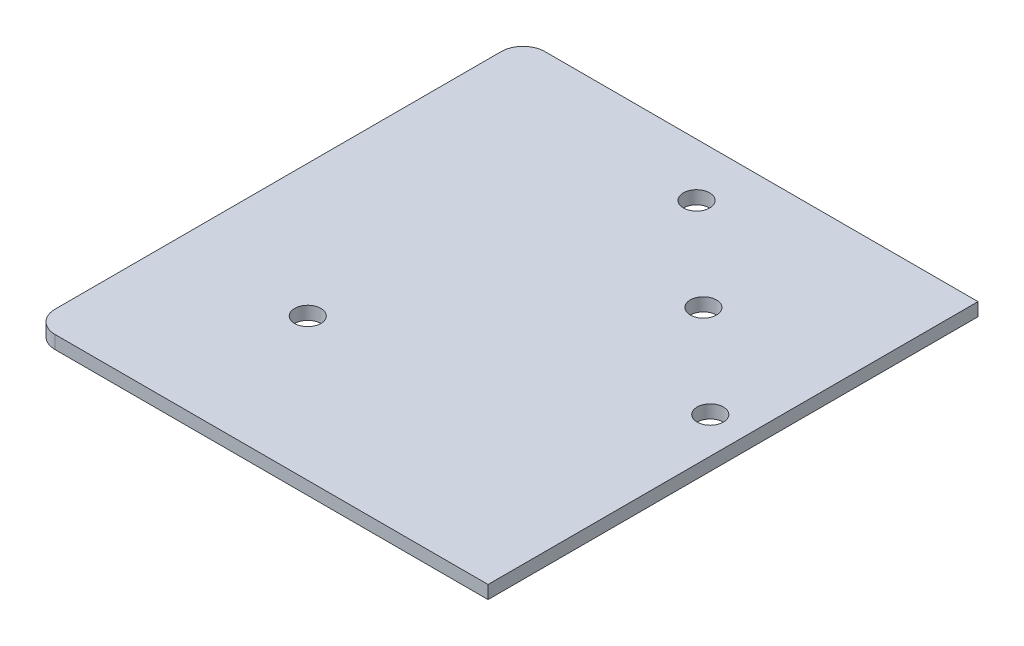
ISO-10303-21;
HEADER;
FILE_DESCRIPTION(('STEP AP214'),'2;1');
FILE_NAME('part.step','',(''),(''),'','','');
FILE_SCHEMA(('AUTOMOTIVE_DESIGN { 1 0 10303 214 1 1 1 1 }'));
ENDSEC;
DATA;
#1=APPLICATION_CONTEXT('core data for automotive mechanical design processes');
#2=APPLICATION_PROTOCOL_DEFINITION('international standard','automotive_design',2000,#1);
#3=PRODUCT_CONTEXT('',#1,'mechanical');
#4=PRODUCT('Part','Part','',(#3));
#5=PRODUCT_RELATED_PRODUCT_CATEGORY('part','',(#4));
#6=PRODUCT_DEFINITION_FORMATION('','',#4);
#7=PRODUCT_DEFINITION_CONTEXT('part definition',#1,'design');
#8=PRODUCT_DEFINITION('design','',#6,#7);
#9=PRODUCT_DEFINITION_SHAPE('','',#8);
#10=(LENGTH_UNIT() NAMED_UNIT(*) SI_UNIT(.MILLI.,.METRE.));
#11=(NAMED_UNIT(*) PLANE_ANGLE_UNIT() SI_UNIT($,.RADIAN.));
#12=(NAMED_UNIT(*) SI_UNIT($,.STERADIAN.) SOLID_ANGLE_UNIT());
#13=UNCERTAINTY_MEASURE_WITH_UNIT(LENGTH_MEASURE(1.E-05),#10,'distance_accuracy_value','');
#14=(GEOMETRIC_REPRESENTATION_CONTEXT(3) GLOBAL_UNCERTAINTY_ASSIGNED_CONTEXT((#13)) GLOBAL_UNIT_ASSIGNED_CONTEXT((#10,
#11,#12)) REPRESENTATION_CONTEXT('',''));
#15=CARTESIAN_POINT('',(0.,0.,0.));
#16=DIRECTION('',(0.,0.,1.));
#17=DIRECTION('',(1.,0.,0.));
#18=AXIS2_PLACEMENT_3D('',#15,#16,#17);
#19=CARTESIAN_POINT('',(228.6,9.525,0.));
#20=DIRECTION('',(1.,0.,0.));
#21=DIRECTION('',(0.,0.,-1.));
#22=AXIS2_PLACEMENT_3D('',#19,#20,#21);
#23=PLANE('',#22);
#24=DIRECTION('',(0.,0.,1.));
#25=VECTOR('',#24,1.);
#26=CARTESIAN_POINT('',(228.6,0.,0.));
#27=LINE('',#26,#25);
#28=CARTESIAN_POINT('',(228.6,0.,-161.925));
#29=VERTEX_POINT('',#28);
#30=CARTESIAN_POINT('',(228.6,0.,161.925));
#31=VERTEX_POINT('',#30);
#32=EDGE_CURVE('E116',#29,#31,#27,.T.);
#33=ORIENTED_EDGE('',*,*,#32,.T.);
#34=DIRECTION('',(0.,-1.,0.));
#35=VECTOR('',#34,1.);
#36=CARTESIAN_POINT('',(228.6,9.525,161.925));
#37=LINE('',#36,#35);
#38=CARTESIAN_POINT('',(228.6,9.525,161.925));
#39=VERTEX_POINT('',#38);
#40=EDGE_CURVE('E58',#31,#39,#37,.F.);
#41=ORIENTED_EDGE('',*,*,#40,.T.);
#42=DIRECTION('',(0.,0.,1.));
#43=VECTOR('',#42,1.);
#44=CARTESIAN_POINT('',(228.6,9.525,0.));
#45=LINE('',#44,#43);
#46=CARTESIAN_POINT('',(228.6,9.525,-161.925));
#47=VERTEX_POINT('',#46);
#48=EDGE_CURVE('E111',#47,#39,#45,.T.);
#49=ORIENTED_EDGE('',*,*,#48,.F.);
#50=DIRECTION('',(0.,-1.,0.));
#51=VECTOR('',#50,1.);
#52=CARTESIAN_POINT('',(228.6,0.,-161.925));
#53=LINE('',#52,#51);
#54=EDGE_CURVE('E134',#47,#29,#53,.T.);
#55=ORIENTED_EDGE('',*,*,#54,.T.);
#56=EDGE_LOOP('',(#33,#41,#49,#55));
#57=FACE_BOUND('',#56,.T.);
#58=ADVANCED_FACE('F37',(#57),#23,.F.);
#59=CARTESIAN_POINT('',(558.8,9.525,0.));
#60=DIRECTION('',(-1.,0.,0.));
#61=DIRECTION('',(0.,0.,1.));
#62=AXIS2_PLACEMENT_3D('',#59,#60,#61);
#63=PLANE('',#62);
#64=DIRECTION('',(0.,0.,-1.));
#65=VECTOR('',#64,1.);
#66=CARTESIAN_POINT('',(558.8,0.,0.));
#67=LINE('',#66,#65);
#68=CARTESIAN_POINT('',(558.8,0.,177.8));
#69=VERTEX_POINT('',#68);
#70=CARTESIAN_POINT('',(558.8,0.,-177.8));
#71=VERTEX_POINT('',#70);
#72=EDGE_CURVE('E118',#69,#71,#67,.T.);
#73=ORIENTED_EDGE('',*,*,#72,.T.);
#74=DIRECTION('',(0.,-1.,0.));
#75=VECTOR('',#74,1.);
#76=CARTESIAN_POINT('',(558.8,9.525,-177.8));
#77=LINE('',#76,#75);
#78=CARTESIAN_POINT('',(558.8,9.525,-177.8));
#79=VERTEX_POINT('',#78);
#80=EDGE_CURVE('E109',#79,#71,#77,.T.);
#81=ORIENTED_EDGE('',*,*,#80,.F.);
#82=DIRECTION('',(0.,0.,-1.));
#83=VECTOR('',#82,1.);
#84=CARTESIAN_POINT('',(558.8,9.525,0.));
#85=LINE('',#84,#83);
#86=CARTESIAN_POINT('',(558.8,9.525,177.8));
#87=VERTEX_POINT('',#86);
#88=EDGE_CURVE('E94',#87,#79,#85,.T.);
#89=ORIENTED_EDGE('',*,*,#88,.F.);
#90=DIRECTION('',(0.,-1.,0.));
#91=VECTOR('',#90,1.);
#92=CARTESIAN_POINT('',(558.8,9.525,177.8));
#93=LINE('',#92,#91);
#94=EDGE_CURVE('E101',#87,#69,#93,.T.);
#95=ORIENTED_EDGE('',*,*,#94,.T.);
#96=EDGE_LOOP('',(#73,#81,#89,#95));
#97=FACE_BOUND('',#96,.T.);
#98=ADVANCED_FACE('F107',(#97),#63,.F.);
#99=CARTESIAN_POINT('',(-912.372794199772,9.525,-177.8));
#100=DIRECTION('',(0.,0.,-1.));
#101=DIRECTION('',(-1.,0.,0.));
#102=AXIS2_PLACEMENT_3D('',#99,#100,#101);
#103=PLANE('',#102);
#104=DIRECTION('',(1.,0.,0.));
#105=VECTOR('',#104,1.);
#106=CARTESIAN_POINT('',(-912.372794199772,0.,-177.8));
#107=LINE('',#106,#105);
#108=CARTESIAN_POINT('',(244.475,0.,-177.8));
#109=VERTEX_POINT('',#108);
#110=EDGE_CURVE('E122',#109,#71,#107,.T.);
#111=ORIENTED_EDGE('',*,*,#110,.F.);
#112=DIRECTION('',(0.,-1.,0.));
#113=VECTOR('',#112,1.);
#114=CARTESIAN_POINT('',(244.475,9.525,-177.8));
#115=LINE('',#114,#113);
#116=CARTESIAN_POINT('',(244.475,9.525,-177.8));
#117=VERTEX_POINT('',#116);
#118=EDGE_CURVE('E11',#109,#117,#115,.F.);
#119=ORIENTED_EDGE('',*,*,#118,.T.);
#120=DIRECTION('',(1.,0.,0.));
#121=VECTOR('',#120,1.);
#122=CARTESIAN_POINT('',(-912.372794199772,9.525,-177.8));
#123=LINE('',#122,#121);
#124=EDGE_CURVE('E110',#117,#79,#123,.T.);
#125=ORIENTED_EDGE('',*,*,#124,.T.);
#126=ORIENTED_EDGE('',*,*,#80,.T.);
#127=EDGE_LOOP('',(#111,#119,#125,#126));
#128=FACE_BOUND('',#127,.T.);
#129=ADVANCED_FACE('F145',(#128),#103,.T.);
#130=CARTESIAN_POINT('',(-912.372794199772,9.525,0.));
#131=DIRECTION('',(0.,1.,0.));
#132=DIRECTION('',(0.,0.,1.));
#133=AXIS2_PLACEMENT_3D('',#130,#131,#132);
#134=PLANE('',#133);
#135=CARTESIAN_POINT('',(393.035251618311,9.525,-139.264785963965));
#136=DIRECTION('',(0.,-1.,0.));
#137=DIRECTION('',(0.,0.,-1.));
#138=AXIS2_PLACEMENT_3D('',#135,#136,#137);
#139=CIRCLE('',#138,9.52500000000002);
#140=CARTESIAN_POINT('',(393.035251618311,9.525,-148.789785963965));
#141=VERTEX_POINT('',#140);
#142=EDGE_CURVE('E165',#141,#141,#139,.T.);
#143=ORIENTED_EDGE('',*,*,#142,.T.);
#144=EDGE_LOOP('',(#143));
#145=FACE_BOUND('',#144,.T.);
#146=CARTESIAN_POINT('',(532.63241177312,9.525,-9.63885153449872));
#147=DIRECTION('',(0.,-1.,0.));
#148=DIRECTION('',(0.,0.,-1.));
#149=AXIS2_PLACEMENT_3D('',#146,#147,#148);
#150=CIRCLE('',#149,9.52500000000002);
#151=CARTESIAN_POINT('',(532.63241177312,9.525,-19.1638515344987));
#152=VERTEX_POINT('',#151);
#153=EDGE_CURVE('E159',#152,#152,#150,.T.);
#154=ORIENTED_EDGE('',*,*,#153,.T.);
#155=EDGE_LOOP('',(#154));
#156=FACE_BOUND('',#155,.T.);
#157=CARTESIAN_POINT('',(462.833831695716,9.525,-74.451818749232));
#158=DIRECTION('',(0.,-1.,0.));
#159=DIRECTION('',(0.,0.,-1.));
#160=AXIS2_PLACEMENT_3D('',#157,#158,#159);
#161=CIRCLE('',#160,9.52500000000002);
#162=CARTESIAN_POINT('',(462.833831695716,9.525,-83.976818749232));
#163=VERTEX_POINT('',#162);
#164=EDGE_CURVE('E153',#163,#163,#161,.T.);
#165=ORIENTED_EDGE('',*,*,#164,.T.);
#166=EDGE_LOOP('',(#165));
#167=FACE_BOUND('',#166,.T.);
#168=CARTESIAN_POINT('',(324.566168304285,9.525,74.4518187492319));
#169=DIRECTION('',(0.,-1.,0.));
#170=DIRECTION('',(0.,0.,-1.));
#171=AXIS2_PLACEMENT_3D('',#168,#169,#170);
#172=CIRCLE('',#171,9.52500000000002);
#173=CARTESIAN_POINT('',(324.566168304285,9.525,64.9268187492319));
#174=VERTEX_POINT('',#173);
#175=EDGE_CURVE('E146',#174,#174,#172,.T.);
#176=ORIENTED_EDGE('',*,*,#175,.T.);
#177=EDGE_LOOP('',(#176));
#178=FACE_BOUND('',#177,.T.);
#179=ORIENTED_EDGE('',*,*,#48,.T.);
#180=CARTESIAN_POINT('',(244.475,9.525,161.925));
#181=DIRECTION('',(0.,1.,0.));
#182=DIRECTION('',(0.,0.,1.));
#183=AXIS2_PLACEMENT_3D('',#180,#181,#182);
#184=CIRCLE('',#183,15.875);
#185=CARTESIAN_POINT('',(244.475,9.525,177.8));
#186=VERTEX_POINT('',#185);
#187=EDGE_CURVE('E45',#39,#186,#184,.T.);
#188=ORIENTED_EDGE('',*,*,#187,.T.);
#189=DIRECTION('',(1.,0.,0.));
#190=VECTOR('',#189,1.);
#191=CARTESIAN_POINT('',(-912.372794199772,9.525,177.8));
#192=LINE('',#191,#190);
#193=EDGE_CURVE('E91',#186,#87,#192,.T.);
#194=ORIENTED_EDGE('',*,*,#193,.T.);
#195=ORIENTED_EDGE('',*,*,#88,.T.);
#196=ORIENTED_EDGE('',*,*,#124,.F.);
#197=CARTESIAN_POINT('',(244.475,9.525,-161.925));
#198=DIRECTION('',(0.,1.,0.));
#199=DIRECTION('',(0.,0.,1.));
#200=AXIS2_PLACEMENT_3D('',#197,#198,#199);
#201=CIRCLE('',#200,15.875);
#202=EDGE_CURVE('E138',#117,#47,#201,.T.);
#203=ORIENTED_EDGE('',*,*,#202,.T.);
#204=EDGE_LOOP('',(#179,#188,#194,#195,#196,#203));
#205=FACE_BOUND('',#204,.T.);
#206=ADVANCED_FACE('F93',(#145,#156,#167,#178,#205),#134,.T.);
#207=CARTESIAN_POINT('',(-912.372794199772,0.,0.));
#208=DIRECTION('',(0.,1.,0.));
#209=DIRECTION('',(0.,0.,1.));
#210=AXIS2_PLACEMENT_3D('',#207,#208,#209);
#211=PLANE('',#210);
#212=CARTESIAN_POINT('',(393.035251618311,0.,-139.264785963965));
#213=DIRECTION('',(0.,-1.,0.));
#214=DIRECTION('',(0.,0.,-1.));
#215=AXIS2_PLACEMENT_3D('',#212,#213,#214);
#216=CIRCLE('',#215,9.52500000000002);
#217=CARTESIAN_POINT('',(393.035251618311,0.,-148.789785963965));
#218=VERTEX_POINT('',#217);
#219=EDGE_CURVE('E168',#218,#218,#216,.T.);
#220=ORIENTED_EDGE('',*,*,#219,.F.);
#221=EDGE_LOOP('',(#220));
#222=FACE_BOUND('',#221,.T.);
#223=CARTESIAN_POINT('',(532.63241177312,0.,-9.63885153449872));
#224=DIRECTION('',(0.,-1.,0.));
#225=DIRECTION('',(0.,0.,-1.));
#226=AXIS2_PLACEMENT_3D('',#223,#224,#225);
#227=CIRCLE('',#226,9.52500000000002);
#228=CARTESIAN_POINT('',(532.63241177312,0.,-19.1638515344987));
#229=VERTEX_POINT('',#228);
#230=EDGE_CURVE('E162',#229,#229,#227,.T.);
#231=ORIENTED_EDGE('',*,*,#230,.F.);
#232=EDGE_LOOP('',(#231));
#233=FACE_BOUND('',#232,.T.);
#234=CARTESIAN_POINT('',(462.833831695716,0.,-74.451818749232));
#235=DIRECTION('',(0.,-1.,0.));
#236=DIRECTION('',(0.,0.,-1.));
#237=AXIS2_PLACEMENT_3D('',#234,#235,#236);
#238=CIRCLE('',#237,9.52500000000002);
#239=CARTESIAN_POINT('',(462.833831695716,0.,-83.976818749232));
#240=VERTEX_POINT('',#239);
#241=EDGE_CURVE('E156',#240,#240,#238,.T.);
#242=ORIENTED_EDGE('',*,*,#241,.F.);
#243=EDGE_LOOP('',(#242));
#244=FACE_BOUND('',#243,.T.);
#245=CARTESIAN_POINT('',(324.566168304285,0.,74.4518187492319));
#246=DIRECTION('',(0.,-1.,0.));
#247=DIRECTION('',(0.,0.,-1.));
#248=AXIS2_PLACEMENT_3D('',#245,#246,#247);
#249=CIRCLE('',#248,9.52500000000002);
#250=CARTESIAN_POINT('',(324.566168304285,0.,64.9268187492319));
#251=VERTEX_POINT('',#250);
#252=EDGE_CURVE('E148',#251,#251,#249,.T.);
#253=ORIENTED_EDGE('',*,*,#252,.F.);
#254=EDGE_LOOP('',(#253));
#255=FACE_BOUND('',#254,.T.);
#256=DIRECTION('',(1.,0.,0.));
#257=VECTOR('',#256,1.);
#258=CARTESIAN_POINT('',(-912.372794199772,0.,177.8));
#259=LINE('',#258,#257);
#260=CARTESIAN_POINT('',(244.475,0.,177.8));
#261=VERTEX_POINT('',#260);
#262=EDGE_CURVE('E102',#261,#69,#259,.T.);
#263=ORIENTED_EDGE('',*,*,#262,.F.);
#264=CARTESIAN_POINT('',(244.475,0.,161.925));
#265=DIRECTION('',(0.,1.,0.));
#266=DIRECTION('',(0.,0.,1.));
#267=AXIS2_PLACEMENT_3D('',#264,#265,#266);
#268=CIRCLE('',#267,15.875);
#269=EDGE_CURVE('E132',#261,#31,#268,.F.);
#270=ORIENTED_EDGE('',*,*,#269,.T.);
#271=ORIENTED_EDGE('',*,*,#32,.F.);
#272=CARTESIAN_POINT('',(244.475,0.,-161.925));
#273=DIRECTION('',(0.,1.,0.));
#274=DIRECTION('',(0.,0.,1.));
#275=AXIS2_PLACEMENT_3D('',#272,#273,#274);
#276=CIRCLE('',#275,15.875);
#277=EDGE_CURVE('E130',#29,#109,#276,.F.);
#278=ORIENTED_EDGE('',*,*,#277,.T.);
#279=ORIENTED_EDGE('',*,*,#110,.T.);
#280=ORIENTED_EDGE('',*,*,#72,.F.);
#281=EDGE_LOOP('',(#263,#270,#271,#278,#279,#280));
#282=FACE_BOUND('',#281,.T.);
#283=ADVANCED_FACE('F144',(#222,#233,#244,#255,#282),#211,.F.);
#284=CARTESIAN_POINT('',(-912.372794199772,9.525,177.8));
#285=DIRECTION('',(0.,0.,-1.));
#286=DIRECTION('',(-1.,0.,0.));
#287=AXIS2_PLACEMENT_3D('',#284,#285,#286);
#288=PLANE('',#287);
#289=ORIENTED_EDGE('',*,*,#193,.F.);
#290=DIRECTION('',(0.,-1.,0.));
#291=VECTOR('',#290,1.);
#292=CARTESIAN_POINT('',(244.475,9.525,177.8));
#293=LINE('',#292,#291);
#294=EDGE_CURVE('E128',#186,#261,#293,.T.);
#295=ORIENTED_EDGE('',*,*,#294,.T.);
#296=ORIENTED_EDGE('',*,*,#262,.T.);
#297=ORIENTED_EDGE('',*,*,#94,.F.);
#298=EDGE_LOOP('',(#289,#295,#296,#297));
#299=FACE_BOUND('',#298,.T.);
#300=ADVANCED_FACE('F113',(#299),#288,.F.);
#301=CARTESIAN_POINT('',(244.475,9.525,161.925));
#302=DIRECTION('',(0.,-1.,0.));
#303=DIRECTION('',(0.,0.,-1.));
#304=AXIS2_PLACEMENT_3D('',#301,#302,#303);
#305=CYLINDRICAL_SURFACE('',#304,15.875);
#306=ORIENTED_EDGE('',*,*,#187,.F.);
#307=ORIENTED_EDGE('',*,*,#40,.F.);
#308=ORIENTED_EDGE('',*,*,#269,.F.);
#309=ORIENTED_EDGE('',*,*,#294,.F.);
#310=EDGE_LOOP('',(#306,#307,#308,#309));
#311=FACE_BOUND('',#310,.T.);
#312=ADVANCED_FACE('F203',(#311),#305,.T.);
#313=CARTESIAN_POINT('',(244.475,9.525,-161.925));
#314=DIRECTION('',(0.,1.,0.));
#315=DIRECTION('',(0.,0.,1.));
#316=AXIS2_PLACEMENT_3D('',#313,#314,#315);
#317=CYLINDRICAL_SURFACE('',#316,15.875);
#318=ORIENTED_EDGE('',*,*,#202,.F.);
#319=ORIENTED_EDGE('',*,*,#118,.F.);
#320=ORIENTED_EDGE('',*,*,#277,.F.);
#321=ORIENTED_EDGE('',*,*,#54,.F.);
#322=EDGE_LOOP('',(#318,#319,#320,#321));
#323=FACE_BOUND('',#322,.T.);
#324=ADVANCED_FACE('F39',(#323),#317,.T.);
#325=CARTESIAN_POINT('',(324.566168304285,9.525,74.4518187492319));
#326=DIRECTION('',(0.,-1.,0.));
#327=DIRECTION('',(0.,0.,-1.));
#328=AXIS2_PLACEMENT_3D('',#325,#326,#327);
#329=CYLINDRICAL_SURFACE('',#328,9.52500000000002);
#330=CARTESIAN_POINT('',(324.566168304285,9.525,64.9268187492319));
#331=CARTESIAN_POINT('',(324.566168304285,9.42578125,64.9268187492319));
#332=CARTESIAN_POINT('',(324.566168304285,9.3265625,64.9268187492319));
#333=CARTESIAN_POINT('',(324.566168304285,9.128125,64.9268187492319));
#334=CARTESIAN_POINT('',(324.566168304285,9.02890625,64.9268187492319));
#335=CARTESIAN_POINT('',(324.566168304285,8.83046875,64.9268187492319));
#336=CARTESIAN_POINT('',(324.566168304285,8.73125,64.9268187492319));
#337=CARTESIAN_POINT('',(324.566168304285,8.5328125,64.9268187492319));
#338=CARTESIAN_POINT('',(324.566168304285,8.43359375,64.9268187492319));
#339=CARTESIAN_POINT('',(324.566168304285,8.23515625,64.9268187492319));
#340=CARTESIAN_POINT('',(324.566168304285,8.1359375,64.9268187492319));
#341=CARTESIAN_POINT('',(324.566168304285,7.9375,64.9268187492319));
#342=CARTESIAN_POINT('',(324.566168304285,7.83828125,64.9268187492319));
#343=CARTESIAN_POINT('',(324.566168304285,7.63984375,64.9268187492319));
#344=CARTESIAN_POINT('',(324.566168304285,7.540625,64.9268187492319));
#345=CARTESIAN_POINT('',(324.566168304285,7.3421875,64.9268187492319));
#346=CARTESIAN_POINT('',(324.566168304285,7.24296875,64.9268187492319));
#347=CARTESIAN_POINT('',(324.566168304285,7.04453125,64.9268187492319));
#348=CARTESIAN_POINT('',(324.566168304285,6.9453125,64.9268187492319));
#349=CARTESIAN_POINT('',(324.566168304285,6.746875,64.9268187492319));
#350=CARTESIAN_POINT('',(324.566168304285,6.64765625,64.9268187492319));
#351=CARTESIAN_POINT('',(324.566168304285,6.44921875,64.9268187492319));
#352=CARTESIAN_POINT('',(324.566168304285,6.35,64.9268187492319));
#353=CARTESIAN_POINT('',(324.566168304285,6.1515625,64.9268187492319));
#354=CARTESIAN_POINT('',(324.566168304285,6.05234375,64.9268187492319));
#355=CARTESIAN_POINT('',(324.566168304285,5.85390625,64.9268187492319));
#356=CARTESIAN_POINT('',(324.566168304285,5.7546875,64.9268187492319));
#357=CARTESIAN_POINT('',(324.566168304285,5.55625,64.9268187492319));
#358=CARTESIAN_POINT('',(324.566168304285,5.45703125,64.9268187492319));
#359=CARTESIAN_POINT('',(324.566168304285,5.25859375,64.9268187492319));
#360=CARTESIAN_POINT('',(324.566168304285,5.159375,64.9268187492319));
#361=CARTESIAN_POINT('',(324.566168304285,4.9609375,64.9268187492319));
#362=CARTESIAN_POINT('',(324.566168304285,4.86171875,64.9268187492319));
#363=CARTESIAN_POINT('',(324.566168304285,4.66328125,64.9268187492319));
#364=CARTESIAN_POINT('',(324.566168304285,4.5640625,64.9268187492319));
#365=CARTESIAN_POINT('',(324.566168304285,4.365625,64.9268187492319));
#366=CARTESIAN_POINT('',(324.566168304285,4.26640625,64.9268187492319));
#367=CARTESIAN_POINT('',(324.566168304285,4.06796875,64.9268187492319));
#368=CARTESIAN_POINT('',(324.566168304285,3.96875,64.9268187492319));
#369=CARTESIAN_POINT('',(324.566168304285,3.7703125,64.9268187492319));
#370=CARTESIAN_POINT('',(324.566168304285,3.67109375,64.9268187492319));
#371=CARTESIAN_POINT('',(324.566168304285,3.47265625,64.9268187492319));
#372=CARTESIAN_POINT('',(324.566168304285,3.3734375,64.9268187492319));
#373=CARTESIAN_POINT('',(324.566168304285,3.175,64.9268187492319));
#374=CARTESIAN_POINT('',(324.566168304285,3.07578125,64.9268187492319));
#375=CARTESIAN_POINT('',(324.566168304285,2.87734375,64.9268187492319));
#376=CARTESIAN_POINT('',(324.566168304285,2.778125,64.9268187492319));
#377=CARTESIAN_POINT('',(324.566168304285,2.5796875,64.9268187492319));
#378=CARTESIAN_POINT('',(324.566168304285,2.48046875,64.9268187492319));
#379=CARTESIAN_POINT('',(324.566168304285,2.28203125,64.9268187492319));
#380=CARTESIAN_POINT('',(324.566168304285,2.1828125,64.9268187492319));
#381=CARTESIAN_POINT('',(324.566168304285,1.984375,64.9268187492319));
#382=CARTESIAN_POINT('',(324.566168304285,1.88515625,64.9268187492319));
#383=CARTESIAN_POINT('',(324.566168304285,1.68671875,64.9268187492319));
#384=CARTESIAN_POINT('',(324.566168304285,1.5875,64.9268187492319));
#385=CARTESIAN_POINT('',(324.566168304285,1.3890625,64.9268187492319));
#386=CARTESIAN_POINT('',(324.566168304285,1.28984375,64.9268187492319));
#387=CARTESIAN_POINT('',(324.566168304285,1.09140625,64.9268187492319));
#388=CARTESIAN_POINT('',(324.566168304285,0.992187500000001,64.9268187492319));
#389=CARTESIAN_POINT('',(324.566168304285,0.793750000000001,64.9268187492319));
#390=CARTESIAN_POINT('',(324.566168304285,0.69453125,64.9268187492319));
#391=CARTESIAN_POINT('',(324.566168304285,0.49609375,64.9268187492319));
#392=CARTESIAN_POINT('',(324.566168304285,0.396875,64.9268187492319));
#393=CARTESIAN_POINT('',(324.566168304285,0.1984375,64.9268187492319));
#394=CARTESIAN_POINT('',(324.566168304285,0.0992187500000001,64.9268187492319));
#395=CARTESIAN_POINT('',(324.566168304285,0.,64.9268187492319));
#396=B_SPLINE_CURVE_WITH_KNOTS('',3,(#330,#331,#332,#333,#334,#335,#336,#337,#338,#339,#340,
#341,#342,#343,#344,#345,#346,#347,#348,#349,#350,#351,#352,#353,#354,#355,#356,#357,#358,#359,
#360,#361,#362,#363,#364,#365,#366,#367,#368,#369,#370,#371,#372,#373,#374,#375,#376,#377,#378,
#379,#380,#381,#382,#383,#384,#385,#386,#387,#388,#389,#390,#391,#392,#393,#394,#395),
.UNSPECIFIED.,.F.,.F.,(4,2,2,2,2,2,2,2,2,2,2,2,2,2,2,2,2,2,2,2,2,2,2,2,2,2,2,2,2,2,2,2,4),(0.,
0.29765625,0.5953125,0.892968750000001,1.190625,1.48828125,1.7859375,2.08359375,2.38125,
2.67890625,2.9765625,3.27421875,3.571875,3.86953125,4.1671875,4.46484375,4.7625,5.06015625,
5.3578125,5.65546875,5.953125,6.25078125,6.5484375,6.84609375,7.14375,7.44140625,7.7390625,
8.03671875,8.334375,8.63203125,8.9296875,9.22734375,9.525),.UNSPECIFIED.);
#397=EDGE_CURVE('BSEAM192',#174,#251,#396,.T.);
#398=ORIENTED_EDGE('',*,*,#175,.F.);
#399=ORIENTED_EDGE('',*,*,#252,.T.);
#400=ORIENTED_EDGE('',*,*,#397,.T.);
#401=ORIENTED_EDGE('',*,*,#397,.F.);
#402=EDGE_LOOP('',(#398,#400,#399,#401));
#403=FACE_BOUND('',#402,.T.);
#404=ADVANCED_FACE('F192',(#403),#329,.F.);
#405=CARTESIAN_POINT('',(462.833831695716,9.525,-74.451818749232));
#406=DIRECTION('',(0.,-1.,0.));
#407=DIRECTION('',(0.,0.,-1.));
#408=AXIS2_PLACEMENT_3D('',#405,#406,#407);
#409=CYLINDRICAL_SURFACE('',#408,9.52500000000002);
#410=CARTESIAN_POINT('',(462.833831695716,9.525,-83.976818749232));
#411=CARTESIAN_POINT('',(462.833831695716,9.42578125,-83.976818749232));
#412=CARTESIAN_POINT('',(462.833831695716,9.3265625,-83.976818749232));
#413=CARTESIAN_POINT('',(462.833831695716,9.128125,-83.976818749232));
#414=CARTESIAN_POINT('',(462.833831695716,9.02890625,-83.976818749232));
#415=CARTESIAN_POINT('',(462.833831695716,8.83046875,-83.976818749232));
#416=CARTESIAN_POINT('',(462.833831695716,8.73125,-83.976818749232));
#417=CARTESIAN_POINT('',(462.833831695716,8.5328125,-83.976818749232));
#418=CARTESIAN_POINT('',(462.833831695716,8.43359375,-83.976818749232));
#419=CARTESIAN_POINT('',(462.833831695716,8.23515625,-83.976818749232));
#420=CARTESIAN_POINT('',(462.833831695716,8.1359375,-83.976818749232));
#421=CARTESIAN_POINT('',(462.833831695716,7.9375,-83.976818749232));
#422=CARTESIAN_POINT('',(462.833831695716,7.83828125,-83.976818749232));
#423=CARTESIAN_POINT('',(462.833831695716,7.63984375,-83.976818749232));
#424=CARTESIAN_POINT('',(462.833831695716,7.540625,-83.976818749232));
#425=CARTESIAN_POINT('',(462.833831695716,7.3421875,-83.976818749232));
#426=CARTESIAN_POINT('',(462.833831695716,7.24296875,-83.976818749232));
#427=CARTESIAN_POINT('',(462.833831695716,7.04453125,-83.976818749232));
#428=CARTESIAN_POINT('',(462.833831695716,6.9453125,-83.976818749232));
#429=CARTESIAN_POINT('',(462.833831695716,6.746875,-83.976818749232));
#430=CARTESIAN_POINT('',(462.833831695716,6.64765625,-83.976818749232));
#431=CARTESIAN_POINT('',(462.833831695716,6.44921875,-83.976818749232));
#432=CARTESIAN_POINT('',(462.833831695716,6.35,-83.976818749232));
#433=CARTESIAN_POINT('',(462.833831695716,6.1515625,-83.976818749232));
#434=CARTESIAN_POINT('',(462.833831695716,6.05234375,-83.976818749232));
#435=CARTESIAN_POINT('',(462.833831695716,5.85390625,-83.976818749232));
#436=CARTESIAN_POINT('',(462.833831695716,5.7546875,-83.976818749232));
#437=CARTESIAN_POINT('',(462.833831695716,5.55625,-83.976818749232));
#438=CARTESIAN_POINT('',(462.833831695716,5.45703125,-83.976818749232));
#439=CARTESIAN_POINT('',(462.833831695716,5.25859375,-83.976818749232));
#440=CARTESIAN_POINT('',(462.833831695716,5.159375,-83.976818749232));
#441=CARTESIAN_POINT('',(462.833831695716,4.9609375,-83.976818749232));
#442=CARTESIAN_POINT('',(462.833831695716,4.86171875,-83.976818749232));
#443=CARTESIAN_POINT('',(462.833831695716,4.66328125,-83.976818749232));
#444=CARTESIAN_POINT('',(462.833831695716,4.5640625,-83.976818749232));
#445=CARTESIAN_POINT('',(462.833831695716,4.365625,-83.976818749232));
#446=CARTESIAN_POINT('',(462.833831695716,4.26640625,-83.976818749232));
#447=CARTESIAN_POINT('',(462.833831695716,4.06796875,-83.976818749232));
#448=CARTESIAN_POINT('',(462.833831695716,3.96875,-83.976818749232));
#449=CARTESIAN_POINT('',(462.833831695716,3.7703125,-83.976818749232));
#450=CARTESIAN_POINT('',(462.833831695716,3.67109375,-83.976818749232));
#451=CARTESIAN_POINT('',(462.833831695716,3.47265625,-83.976818749232));
#452=CARTESIAN_POINT('',(462.833831695716,3.3734375,-83.976818749232));
#453=CARTESIAN_POINT('',(462.833831695716,3.175,-83.976818749232));
#454=CARTESIAN_POINT('',(462.833831695716,3.07578125,-83.976818749232));
#455=CARTESIAN_POINT('',(462.833831695716,2.87734375,-83.976818749232));
#456=CARTESIAN_POINT('',(462.833831695716,2.778125,-83.976818749232));
#457=CARTESIAN_POINT('',(462.833831695716,2.5796875,-83.976818749232));
#458=CARTESIAN_POINT('',(462.833831695716,2.48046875,-83.976818749232));
#459=CARTESIAN_POINT('',(462.833831695716,2.28203125,-83.976818749232));
#460=CARTESIAN_POINT('',(462.833831695716,2.1828125,-83.976818749232));
#461=CARTESIAN_POINT('',(462.833831695716,1.984375,-83.976818749232));
#462=CARTESIAN_POINT('',(462.833831695716,1.88515625,-83.976818749232));
#463=CARTESIAN_POINT('',(462.833831695716,1.68671875,-83.976818749232));
#464=CARTESIAN_POINT('',(462.833831695716,1.5875,-83.976818749232));
#465=CARTESIAN_POINT('',(462.833831695716,1.3890625,-83.976818749232));
#466=CARTESIAN_POINT('',(462.833831695716,1.28984375,-83.976818749232));
#467=CARTESIAN_POINT('',(462.833831695716,1.09140625,-83.976818749232));
#468=CARTESIAN_POINT('',(462.833831695716,0.992187500000001,-83.976818749232));
#469=CARTESIAN_POINT('',(462.833831695716,0.793750000000001,-83.976818749232));
#470=CARTESIAN_POINT('',(462.833831695716,0.69453125,-83.976818749232));
#471=CARTESIAN_POINT('',(462.833831695716,0.49609375,-83.976818749232));
#472=CARTESIAN_POINT('',(462.833831695716,0.396875,-83.976818749232));
#473=CARTESIAN_POINT('',(462.833831695716,0.1984375,-83.976818749232));
#474=CARTESIAN_POINT('',(462.833831695716,0.0992187500000001,-83.976818749232));
#475=CARTESIAN_POINT('',(462.833831695716,0.,-83.976818749232));
#476=B_SPLINE_CURVE_WITH_KNOTS('',3,(#410,#411,#412,#413,#414,#415,#416,#417,#418,#419,#420,
#421,#422,#423,#424,#425,#426,#427,#428,#429,#430,#431,#432,#433,#434,#435,#436,#437,#438,#439,
#440,#441,#442,#443,#444,#445,#446,#447,#448,#449,#450,#451,#452,#453,#454,#455,#456,#457,#458,
#459,#460,#461,#462,#463,#464,#465,#466,#467,#468,#469,#470,#471,#472,#473,#474,#475),
.UNSPECIFIED.,.F.,.F.,(4,2,2,2,2,2,2,2,2,2,2,2,2,2,2,2,2,2,2,2,2,2,2,2,2,2,2,2,2,2,2,2,4),(0.,
0.29765625,0.5953125,0.892968750000001,1.190625,1.48828125,1.7859375,2.08359375,2.38125,
2.67890625,2.9765625,3.27421875,3.571875,3.86953125,4.1671875,4.46484375,4.7625,5.06015625,
5.3578125,5.65546875,5.953125,6.25078125,6.5484375,6.84609375,7.14375,7.44140625,7.7390625,
8.03671875,8.334375,8.63203125,8.9296875,9.22734375,9.525),.UNSPECIFIED.);
#477=EDGE_CURVE('BSEAM194',#163,#240,#476,.T.);
#478=ORIENTED_EDGE('',*,*,#164,.F.);
#479=ORIENTED_EDGE('',*,*,#241,.T.);
#480=ORIENTED_EDGE('',*,*,#477,.T.);
#481=ORIENTED_EDGE('',*,*,#477,.F.);
#482=EDGE_LOOP('',(#478,#480,#479,#481));
#483=FACE_BOUND('',#482,.T.);
#484=ADVANCED_FACE('F194',(#483),#409,.F.);
#485=CARTESIAN_POINT('',(532.63241177312,9.525,-9.63885153449872));
#486=DIRECTION('',(0.,-1.,0.));
#487=DIRECTION('',(0.,0.,-1.));
#488=AXIS2_PLACEMENT_3D('',#485,#486,#487);
#489=CYLINDRICAL_SURFACE('',#488,9.52500000000002);
#490=CARTESIAN_POINT('',(532.63241177312,9.525,-19.1638515344987));
#491=CARTESIAN_POINT('',(532.63241177312,9.42578125,-19.1638515344987));
#492=CARTESIAN_POINT('',(532.63241177312,9.3265625,-19.1638515344987));
#493=CARTESIAN_POINT('',(532.63241177312,9.128125,-19.1638515344987));
#494=CARTESIAN_POINT('',(532.63241177312,9.02890625,-19.1638515344987));
#495=CARTESIAN_POINT('',(532.63241177312,8.83046875,-19.1638515344987));
#496=CARTESIAN_POINT('',(532.63241177312,8.73125,-19.1638515344987));
#497=CARTESIAN_POINT('',(532.63241177312,8.5328125,-19.1638515344987));
#498=CARTESIAN_POINT('',(532.63241177312,8.43359375,-19.1638515344987));
#499=CARTESIAN_POINT('',(532.63241177312,8.23515625,-19.1638515344987));
#500=CARTESIAN_POINT('',(532.63241177312,8.1359375,-19.1638515344987));
#501=CARTESIAN_POINT('',(532.63241177312,7.9375,-19.1638515344987));
#502=CARTESIAN_POINT('',(532.63241177312,7.83828125,-19.1638515344987));
#503=CARTESIAN_POINT('',(532.63241177312,7.63984375,-19.1638515344987));
#504=CARTESIAN_POINT('',(532.63241177312,7.540625,-19.1638515344987));
#505=CARTESIAN_POINT('',(532.63241177312,7.3421875,-19.1638515344987));
#506=CARTESIAN_POINT('',(532.63241177312,7.24296875,-19.1638515344987));
#507=CARTESIAN_POINT('',(532.63241177312,7.04453125,-19.1638515344987));
#508=CARTESIAN_POINT('',(532.63241177312,6.9453125,-19.1638515344987));
#509=CARTESIAN_POINT('',(532.63241177312,6.746875,-19.1638515344987));
#510=CARTESIAN_POINT('',(532.63241177312,6.64765625,-19.1638515344987));
#511=CARTESIAN_POINT('',(532.63241177312,6.44921875,-19.1638515344987));
#512=CARTESIAN_POINT('',(532.63241177312,6.35,-19.1638515344987));
#513=CARTESIAN_POINT('',(532.63241177312,6.1515625,-19.1638515344987));
#514=CARTESIAN_POINT('',(532.63241177312,6.05234375,-19.1638515344987));
#515=CARTESIAN_POINT('',(532.63241177312,5.85390625,-19.1638515344987));
#516=CARTESIAN_POINT('',(532.63241177312,5.7546875,-19.1638515344987));
#517=CARTESIAN_POINT('',(532.63241177312,5.55625,-19.1638515344987));
#518=CARTESIAN_POINT('',(532.63241177312,5.45703125,-19.1638515344987));
#519=CARTESIAN_POINT('',(532.63241177312,5.25859375,-19.1638515344987));
#520=CARTESIAN_POINT('',(532.63241177312,5.159375,-19.1638515344987));
#521=CARTESIAN_POINT('',(532.63241177312,4.9609375,-19.1638515344987));
#522=CARTESIAN_POINT('',(532.63241177312,4.86171875,-19.1638515344987));
#523=CARTESIAN_POINT('',(532.63241177312,4.66328125,-19.1638515344987));
#524=CARTESIAN_POINT('',(532.63241177312,4.5640625,-19.1638515344987));
#525=CARTESIAN_POINT('',(532.63241177312,4.365625,-19.1638515344987));
#526=CARTESIAN_POINT('',(532.63241177312,4.26640625,-19.1638515344987));
#527=CARTESIAN_POINT('',(532.63241177312,4.06796875,-19.1638515344987));
#528=CARTESIAN_POINT('',(532.63241177312,3.96875,-19.1638515344987));
#529=CARTESIAN_POINT('',(532.63241177312,3.7703125,-19.1638515344987));
#530=CARTESIAN_POINT('',(532.63241177312,3.67109375,-19.1638515344987));
#531=CARTESIAN_POINT('',(532.63241177312,3.47265625,-19.1638515344987));
#532=CARTESIAN_POINT('',(532.63241177312,3.3734375,-19.1638515344987));
#533=CARTESIAN_POINT('',(532.63241177312,3.175,-19.1638515344987));
#534=CARTESIAN_POINT('',(532.63241177312,3.07578125,-19.1638515344987));
#535=CARTESIAN_POINT('',(532.63241177312,2.87734375,-19.1638515344987));
#536=CARTESIAN_POINT('',(532.63241177312,2.778125,-19.1638515344987));
#537=CARTESIAN_POINT('',(532.63241177312,2.5796875,-19.1638515344987));
#538=CARTESIAN_POINT('',(532.63241177312,2.48046875,-19.1638515344987));
#539=CARTESIAN_POINT('',(532.63241177312,2.28203125,-19.1638515344987));
#540=CARTESIAN_POINT('',(532.63241177312,2.1828125,-19.1638515344987));
#541=CARTESIAN_POINT('',(532.63241177312,1.984375,-19.1638515344987));
#542=CARTESIAN_POINT('',(532.63241177312,1.88515625,-19.1638515344987));
#543=CARTESIAN_POINT('',(532.63241177312,1.68671875,-19.1638515344987));
#544=CARTESIAN_POINT('',(532.63241177312,1.5875,-19.1638515344987));
#545=CARTESIAN_POINT('',(532.63241177312,1.3890625,-19.1638515344987));
#546=CARTESIAN_POINT('',(532.63241177312,1.28984375,-19.1638515344987));
#547=CARTESIAN_POINT('',(532.63241177312,1.09140625,-19.1638515344987));
#548=CARTESIAN_POINT('',(532.63241177312,0.992187500000001,-19.1638515344987));
#549=CARTESIAN_POINT('',(532.63241177312,0.793750000000001,-19.1638515344987));
#550=CARTESIAN_POINT('',(532.63241177312,0.69453125,-19.1638515344987));
#551=CARTESIAN_POINT('',(532.63241177312,0.49609375,-19.1638515344987));
#552=CARTESIAN_POINT('',(532.63241177312,0.396875,-19.1638515344987));
#553=CARTESIAN_POINT('',(532.63241177312,0.1984375,-19.1638515344987));
#554=CARTESIAN_POINT('',(532.63241177312,0.0992187500000001,-19.1638515344987));
#555=CARTESIAN_POINT('',(532.63241177312,0.,-19.1638515344987));
#556=B_SPLINE_CURVE_WITH_KNOTS('',3,(#490,#491,#492,#493,#494,#495,#496,#497,#498,#499,#500,
#501,#502,#503,#504,#505,#506,#507,#508,#509,#510,#511,#512,#513,#514,#515,#516,#517,#518,#519,
#520,#521,#522,#523,#524,#525,#526,#527,#528,#529,#530,#531,#532,#533,#534,#535,#536,#537,#538,
#539,#540,#541,#542,#543,#544,#545,#546,#547,#548,#549,#550,#551,#552,#553,#554,#555),
.UNSPECIFIED.,.F.,.F.,(4,2,2,2,2,2,2,2,2,2,2,2,2,2,2,2,2,2,2,2,2,2,2,2,2,2,2,2,2,2,2,2,4),(0.,
0.29765625,0.5953125,0.892968750000001,1.190625,1.48828125,1.7859375,2.08359375,2.38125,
2.67890625,2.9765625,3.27421875,3.571875,3.86953125,4.1671875,4.46484375,4.7625,5.06015625,
5.3578125,5.65546875,5.953125,6.25078125,6.5484375,6.84609375,7.14375,7.44140625,7.7390625,
8.03671875,8.334375,8.63203125,8.9296875,9.22734375,9.525),.UNSPECIFIED.);
#557=EDGE_CURVE('BSEAM179',#152,#229,#556,.T.);
#558=ORIENTED_EDGE('',*,*,#153,.F.);
#559=ORIENTED_EDGE('',*,*,#230,.T.);
#560=ORIENTED_EDGE('',*,*,#557,.T.);
#561=ORIENTED_EDGE('',*,*,#557,.F.);
#562=EDGE_LOOP('',(#558,#560,#559,#561));
#563=FACE_BOUND('',#562,.T.);
#564=ADVANCED_FACE('F179',(#563),#489,.F.);
#565=CARTESIAN_POINT('',(393.035251618311,9.525,-139.264785963965));
#566=DIRECTION('',(0.,-1.,0.));
#567=DIRECTION('',(0.,0.,-1.));
#568=AXIS2_PLACEMENT_3D('',#565,#566,#567);
#569=CYLINDRICAL_SURFACE('',#568,9.52500000000002);
#570=CARTESIAN_POINT('',(393.035251618311,9.525,-148.789785963965));
#571=CARTESIAN_POINT('',(393.035251618311,9.42578125,-148.789785963965));
#572=CARTESIAN_POINT('',(393.035251618311,9.3265625,-148.789785963965));
#573=CARTESIAN_POINT('',(393.035251618311,9.128125,-148.789785963965));
#574=CARTESIAN_POINT('',(393.035251618311,9.02890625,-148.789785963965));
#575=CARTESIAN_POINT('',(393.035251618311,8.83046875,-148.789785963965));
#576=CARTESIAN_POINT('',(393.035251618311,8.73125,-148.789785963965));
#577=CARTESIAN_POINT('',(393.035251618311,8.5328125,-148.789785963965));
#578=CARTESIAN_POINT('',(393.035251618311,8.43359375,-148.789785963965));
#579=CARTESIAN_POINT('',(393.035251618311,8.23515625,-148.789785963965));
#580=CARTESIAN_POINT('',(393.035251618311,8.1359375,-148.789785963965));
#581=CARTESIAN_POINT('',(393.035251618311,7.9375,-148.789785963965));
#582=CARTESIAN_POINT('',(393.035251618311,7.83828125,-148.789785963965));
#583=CARTESIAN_POINT('',(393.035251618311,7.63984375,-148.789785963965));
#584=CARTESIAN_POINT('',(393.035251618311,7.540625,-148.789785963965));
#585=CARTESIAN_POINT('',(393.035251618311,7.3421875,-148.789785963965));
#586=CARTESIAN_POINT('',(393.035251618311,7.24296875,-148.789785963965));
#587=CARTESIAN_POINT('',(393.035251618311,7.04453125,-148.789785963965));
#588=CARTESIAN_POINT('',(393.035251618311,6.9453125,-148.789785963965));
#589=CARTESIAN_POINT('',(393.035251618311,6.746875,-148.789785963965));
#590=CARTESIAN_POINT('',(393.035251618311,6.64765625,-148.789785963965));
#591=CARTESIAN_POINT('',(393.035251618311,6.44921875,-148.789785963965));
#592=CARTESIAN_POINT('',(393.035251618311,6.35,-148.789785963965));
#593=CARTESIAN_POINT('',(393.035251618311,6.1515625,-148.789785963965));
#594=CARTESIAN_POINT('',(393.035251618311,6.05234375,-148.789785963965));
#595=CARTESIAN_POINT('',(393.035251618311,5.85390625,-148.789785963965));
#596=CARTESIAN_POINT('',(393.035251618311,5.7546875,-148.789785963965));
#597=CARTESIAN_POINT('',(393.035251618311,5.55625,-148.789785963965));
#598=CARTESIAN_POINT('',(393.035251618311,5.45703125,-148.789785963965));
#599=CARTESIAN_POINT('',(393.035251618311,5.25859375,-148.789785963965));
#600=CARTESIAN_POINT('',(393.035251618311,5.159375,-148.789785963965));
#601=CARTESIAN_POINT('',(393.035251618311,4.9609375,-148.789785963965));
#602=CARTESIAN_POINT('',(393.035251618311,4.86171875,-148.789785963965));
#603=CARTESIAN_POINT('',(393.035251618311,4.66328125,-148.789785963965));
#604=CARTESIAN_POINT('',(393.035251618311,4.5640625,-148.789785963965));
#605=CARTESIAN_POINT('',(393.035251618311,4.365625,-148.789785963965));
#606=CARTESIAN_POINT('',(393.035251618311,4.26640625,-148.789785963965));
#607=CARTESIAN_POINT('',(393.035251618311,4.06796875,-148.789785963965));
#608=CARTESIAN_POINT('',(393.035251618311,3.96875,-148.789785963965));
#609=CARTESIAN_POINT('',(393.035251618311,3.7703125,-148.789785963965));
#610=CARTESIAN_POINT('',(393.035251618311,3.67109375,-148.789785963965));
#611=CARTESIAN_POINT('',(393.035251618311,3.47265625,-148.789785963965));
#612=CARTESIAN_POINT('',(393.035251618311,3.3734375,-148.789785963965));
#613=CARTESIAN_POINT('',(393.035251618311,3.175,-148.789785963965));
#614=CARTESIAN_POINT('',(393.035251618311,3.07578125,-148.789785963965));
#615=CARTESIAN_POINT('',(393.035251618311,2.87734375,-148.789785963965));
#616=CARTESIAN_POINT('',(393.035251618311,2.778125,-148.789785963965));
#617=CARTESIAN_POINT('',(393.035251618311,2.5796875,-148.789785963965));
#618=CARTESIAN_POINT('',(393.035251618311,2.48046875,-148.789785963965));
#619=CARTESIAN_POINT('',(393.035251618311,2.28203125,-148.789785963965));
#620=CARTESIAN_POINT('',(393.035251618311,2.1828125,-148.789785963965));
#621=CARTESIAN_POINT('',(393.035251618311,1.984375,-148.789785963965));
#622=CARTESIAN_POINT('',(393.035251618311,1.88515625,-148.789785963965));
#623=CARTESIAN_POINT('',(393.035251618311,1.68671875,-148.789785963965));
#624=CARTESIAN_POINT('',(393.035251618311,1.5875,-148.789785963965));
#625=CARTESIAN_POINT('',(393.035251618311,1.3890625,-148.789785963965));
#626=CARTESIAN_POINT('',(393.035251618311,1.28984375,-148.789785963965));
#627=CARTESIAN_POINT('',(393.035251618311,1.09140625,-148.789785963965));
#628=CARTESIAN_POINT('',(393.035251618311,0.992187500000001,-148.789785963965));
#629=CARTESIAN_POINT('',(393.035251618311,0.793750000000001,-148.789785963965));
#630=CARTESIAN_POINT('',(393.035251618311,0.69453125,-148.789785963965));
#631=CARTESIAN_POINT('',(393.035251618311,0.49609375,-148.789785963965));
#632=CARTESIAN_POINT('',(393.035251618311,0.396875,-148.789785963965));
#633=CARTESIAN_POINT('',(393.035251618311,0.1984375,-148.789785963965));
#634=CARTESIAN_POINT('',(393.035251618311,0.0992187500000001,-148.789785963965));
#635=CARTESIAN_POINT('',(393.035251618311,0.,-148.789785963965));
#636=B_SPLINE_CURVE_WITH_KNOTS('',3,(#570,#571,#572,#573,#574,#575,#576,#577,#578,#579,#580,
#581,#582,#583,#584,#585,#586,#587,#588,#589,#590,#591,#592,#593,#594,#595,#596,#597,#598,#599,
#600,#601,#602,#603,#604,#605,#606,#607,#608,#609,#610,#611,#612,#613,#614,#615,#616,#617,#618,
#619,#620,#621,#622,#623,#624,#625,#626,#627,#628,#629,#630,#631,#632,#633,#634,#635),
.UNSPECIFIED.,.F.,.F.,(4,2,2,2,2,2,2,2,2,2,2,2,2,2,2,2,2,2,2,2,2,2,2,2,2,2,2,2,2,2,2,2,4),(0.,
0.29765625,0.5953125,0.892968750000001,1.190625,1.48828125,1.7859375,2.08359375,2.38125,
2.67890625,2.9765625,3.27421875,3.571875,3.86953125,4.1671875,4.46484375,4.7625,5.06015625,
5.3578125,5.65546875,5.953125,6.25078125,6.5484375,6.84609375,7.14375,7.44140625,7.7390625,
8.03671875,8.334375,8.63203125,8.9296875,9.22734375,9.525),.UNSPECIFIED.);
#637=EDGE_CURVE('BSEAM176',#141,#218,#636,.T.);
#638=ORIENTED_EDGE('',*,*,#142,.F.);
#639=ORIENTED_EDGE('',*,*,#219,.T.);
#640=ORIENTED_EDGE('',*,*,#637,.T.);
#641=ORIENTED_EDGE('',*,*,#637,.F.);
#642=EDGE_LOOP('',(#638,#640,#639,#641));
#643=FACE_BOUND('',#642,.T.);
#644=ADVANCED_FACE('F176',(#643),#569,.F.);
#645=CLOSED_SHELL('',(#58,#98,#129,#206,#283,#300,#312,#324,#404,#484,#564,#644));
#646=MANIFOLD_SOLID_BREP('B2',#645);
#647=ADVANCED_BREP_SHAPE_REPRESENTATION('',(#18,#646),#14);
#648=SHAPE_DEFINITION_REPRESENTATION(#9,#647);
ENDSEC;
END-ISO-10303-21;
